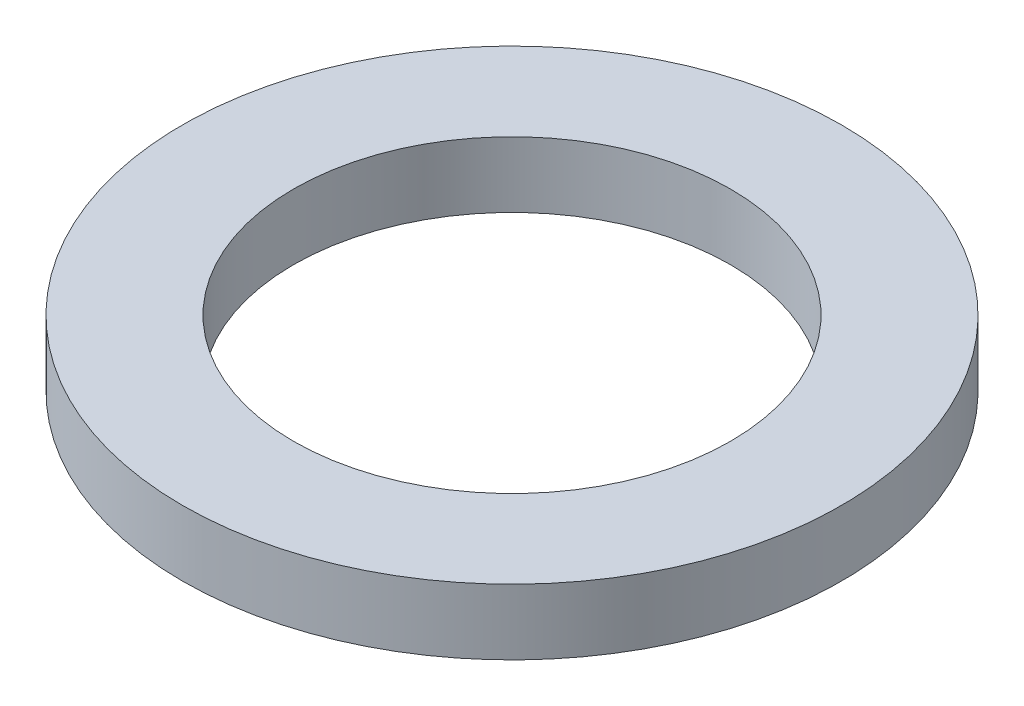
ISO-10303-21;
HEADER;
FILE_DESCRIPTION(('STEP AP214'),'2;1');
FILE_NAME('part.step','',(''),(''),'','','');
FILE_SCHEMA(('AUTOMOTIVE_DESIGN { 1 0 10303 214 1 1 1 1 }'));
ENDSEC;
DATA;
#1=APPLICATION_CONTEXT('core data for automotive mechanical design processes');
#2=APPLICATION_PROTOCOL_DEFINITION('international standard','automotive_design',2000,#1);
#3=PRODUCT_CONTEXT('',#1,'mechanical');
#4=PRODUCT('Part','Part','',(#3));
#5=PRODUCT_RELATED_PRODUCT_CATEGORY('part','',(#4));
#6=PRODUCT_DEFINITION_FORMATION('','',#4);
#7=PRODUCT_DEFINITION_CONTEXT('part definition',#1,'design');
#8=PRODUCT_DEFINITION('design','',#6,#7);
#9=PRODUCT_DEFINITION_SHAPE('','',#8);
#10=(LENGTH_UNIT() NAMED_UNIT(*) SI_UNIT(.MILLI.,.METRE.));
#11=(NAMED_UNIT(*) PLANE_ANGLE_UNIT() SI_UNIT($,.RADIAN.));
#12=(NAMED_UNIT(*) SI_UNIT($,.STERADIAN.) SOLID_ANGLE_UNIT());
#13=UNCERTAINTY_MEASURE_WITH_UNIT(LENGTH_MEASURE(1.E-05),#10,'distance_accuracy_value','');
#14=(GEOMETRIC_REPRESENTATION_CONTEXT(3) GLOBAL_UNCERTAINTY_ASSIGNED_CONTEXT((#13)) GLOBAL_UNIT_ASSIGNED_CONTEXT((#10,
#11,#12)) REPRESENTATION_CONTEXT('',''));
#15=CARTESIAN_POINT('',(0.,0.,0.));
#16=DIRECTION('',(0.,0.,1.));
#17=DIRECTION('',(1.,0.,0.));
#18=AXIS2_PLACEMENT_3D('',#15,#16,#17);
#19=CARTESIAN_POINT('',(0.,0.75,0.));
#20=DIRECTION('',(0.,1.,0.));
#21=DIRECTION('',(0.,0.,1.));
#22=AXIS2_PLACEMENT_3D('',#19,#20,#21);
#23=PLANE('',#22);
#24=CARTESIAN_POINT('',(0.,0.75,0.));
#25=DIRECTION('',(0.,1.,0.));
#26=DIRECTION('',(0.,0.,1.));
#27=AXIS2_PLACEMENT_3D('',#24,#25,#26);
#28=CIRCLE('',#27,3.76906403026729);
#29=CARTESIAN_POINT('',(0.,0.75,3.76906403026729));
#30=VERTEX_POINT('',#29);
#31=EDGE_CURVE('E10',#30,#30,#28,.T.);
#32=ORIENTED_EDGE('',*,*,#31,.T.);
#33=EDGE_LOOP('',(#32));
#34=FACE_BOUND('',#33,.T.);
#35=CARTESIAN_POINT('',(0.,0.75,0.));
#36=DIRECTION('',(0.,1.,0.));
#37=DIRECTION('',(0.,0.,1.));
#38=AXIS2_PLACEMENT_3D('',#35,#36,#37);
#39=CIRCLE('',#38,2.49906403026729);
#40=CARTESIAN_POINT('',(0.,0.75,2.49906403026729));
#41=VERTEX_POINT('',#40);
#42=EDGE_CURVE('E42',#41,#41,#39,.T.);
#43=ORIENTED_EDGE('',*,*,#42,.F.);
#44=EDGE_LOOP('',(#43));
#45=FACE_BOUND('',#44,.T.);
#46=ADVANCED_FACE('F31',(#34,#45),#23,.T.);
#47=CARTESIAN_POINT('',(0.,0.,0.));
#48=DIRECTION('',(0.,1.,0.));
#49=DIRECTION('',(0.,0.,1.));
#50=AXIS2_PLACEMENT_3D('',#47,#48,#49);
#51=PLANE('',#50);
#52=CARTESIAN_POINT('',(0.,0.,0.));
#53=DIRECTION('',(0.,1.,0.));
#54=DIRECTION('',(0.,0.,1.));
#55=AXIS2_PLACEMENT_3D('',#52,#53,#54);
#56=CIRCLE('',#55,3.76906403026729);
#57=CARTESIAN_POINT('',(0.,0.,3.76906403026729));
#58=VERTEX_POINT('',#57);
#59=EDGE_CURVE('E35',#58,#58,#56,.T.);
#60=ORIENTED_EDGE('',*,*,#59,.F.);
#61=EDGE_LOOP('',(#60));
#62=FACE_BOUND('',#61,.T.);
#63=CARTESIAN_POINT('',(0.,0.,0.));
#64=DIRECTION('',(0.,1.,0.));
#65=DIRECTION('',(0.,0.,1.));
#66=AXIS2_PLACEMENT_3D('',#63,#64,#65);
#67=CIRCLE('',#66,2.49906403026729);
#68=CARTESIAN_POINT('',(0.,0.,2.49906403026729));
#69=VERTEX_POINT('',#68);
#70=EDGE_CURVE('E44',#69,#69,#67,.T.);
#71=ORIENTED_EDGE('',*,*,#70,.T.);
#72=EDGE_LOOP('',(#71));
#73=FACE_BOUND('',#72,.T.);
#74=ADVANCED_FACE('F54',(#62,#73),#51,.F.);
#75=CARTESIAN_POINT('',(0.,0.75,0.));
#76=DIRECTION('',(0.,-1.,0.));
#77=DIRECTION('',(0.,0.,-1.));
#78=AXIS2_PLACEMENT_3D('',#75,#76,#77);
#79=CYLINDRICAL_SURFACE('',#78,3.76906403026729);
#80=ORIENTED_EDGE('',*,*,#31,.F.);
#81=EDGE_LOOP('',(#80));
#82=FACE_BOUND('',#81,.T.);
#83=ORIENTED_EDGE('',*,*,#59,.T.);
#84=EDGE_LOOP('',(#83));
#85=FACE_BOUND('',#84,.T.);
#86=ADVANCED_FACE('F33',(#82,#85),#79,.T.);
#87=CARTESIAN_POINT('',(0.,0.75,0.));
#88=DIRECTION('',(0.,-1.,0.));
#89=DIRECTION('',(0.,0.,-1.));
#90=AXIS2_PLACEMENT_3D('',#87,#88,#89);
#91=CYLINDRICAL_SURFACE('',#90,2.49906403026729);
#92=ORIENTED_EDGE('',*,*,#42,.T.);
#93=EDGE_LOOP('',(#92));
#94=FACE_BOUND('',#93,.T.);
#95=ORIENTED_EDGE('',*,*,#70,.F.);
#96=EDGE_LOOP('',(#95));
#97=FACE_BOUND('',#96,.T.);
#98=ADVANCED_FACE('F50',(#94,#97),#91,.F.);
#99=CLOSED_SHELL('',(#46,#74,#86,#98));
#100=MANIFOLD_SOLID_BREP('B2',#99);
#101=ADVANCED_BREP_SHAPE_REPRESENTATION('',(#18,#100),#14);
#102=SHAPE_DEFINITION_REPRESENTATION(#9,#101);
ENDSEC;
END-ISO-10303-21;
